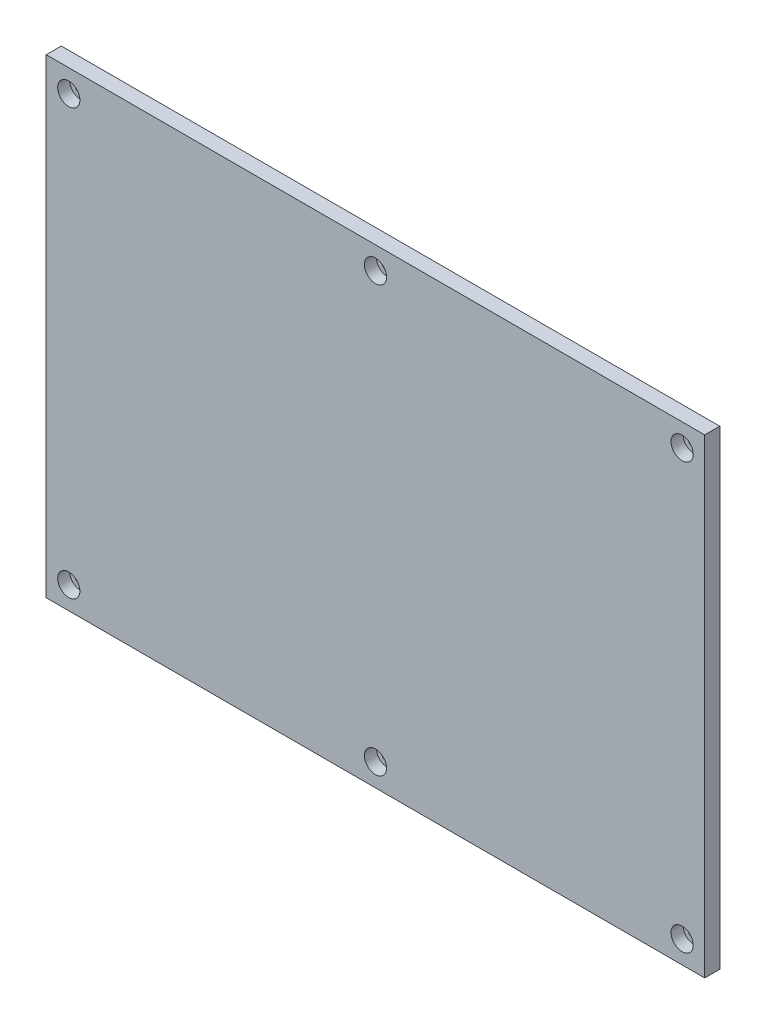
ISO-10303-21;
HEADER;
FILE_DESCRIPTION(('STEP AP214'),'2;1');
FILE_NAME('part.step','',(''),(''),'','','');
FILE_SCHEMA(('AUTOMOTIVE_DESIGN { 1 0 10303 214 1 1 1 1 }'));
ENDSEC;
DATA;
#1=APPLICATION_CONTEXT('core data for automotive mechanical design processes');
#2=APPLICATION_PROTOCOL_DEFINITION('international standard','automotive_design',2000,#1);
#3=PRODUCT_CONTEXT('',#1,'mechanical');
#4=PRODUCT('Part','Part','',(#3));
#5=PRODUCT_RELATED_PRODUCT_CATEGORY('part','',(#4));
#6=PRODUCT_DEFINITION_FORMATION('','',#4);
#7=PRODUCT_DEFINITION_CONTEXT('part definition',#1,'design');
#8=PRODUCT_DEFINITION('design','',#6,#7);
#9=PRODUCT_DEFINITION_SHAPE('','',#8);
#10=(LENGTH_UNIT() NAMED_UNIT(*) SI_UNIT(.MILLI.,.METRE.));
#11=(NAMED_UNIT(*) PLANE_ANGLE_UNIT() SI_UNIT($,.RADIAN.));
#12=(NAMED_UNIT(*) SI_UNIT($,.STERADIAN.) SOLID_ANGLE_UNIT());
#13=UNCERTAINTY_MEASURE_WITH_UNIT(LENGTH_MEASURE(1.E-05),#10,'distance_accuracy_value','');
#14=(GEOMETRIC_REPRESENTATION_CONTEXT(3) GLOBAL_UNCERTAINTY_ASSIGNED_CONTEXT((#13)) GLOBAL_UNIT_ASSIGNED_CONTEXT((#10,
#11,#12)) REPRESENTATION_CONTEXT('',''));
#15=CARTESIAN_POINT('',(0.,0.,0.));
#16=DIRECTION('',(0.,0.,1.));
#17=DIRECTION('',(1.,0.,0.));
#18=AXIS2_PLACEMENT_3D('',#15,#16,#17);
#19=CARTESIAN_POINT('',(0.,0.,4.));
#20=DIRECTION('',(1.,0.,0.));
#21=DIRECTION('',(0.,0.,-1.));
#22=AXIS2_PLACEMENT_3D('',#19,#20,#21);
#23=PLANE('',#22);
#24=DIRECTION('',(0.,-1.,0.));
#25=VECTOR('',#24,1.);
#26=CARTESIAN_POINT('',(0.,0.,0.));
#27=LINE('',#26,#25);
#28=CARTESIAN_POINT('',(0.,125.,0.));
#29=VERTEX_POINT('',#28);
#30=CARTESIAN_POINT('',(0.,0.,0.));
#31=VERTEX_POINT('',#30);
#32=EDGE_CURVE('E107',#29,#31,#27,.T.);
#33=ORIENTED_EDGE('',*,*,#32,.T.);
#34=DIRECTION('',(0.,0.,-1.));
#35=VECTOR('',#34,1.);
#36=CARTESIAN_POINT('',(0.,0.,4.));
#37=LINE('',#36,#35);
#38=CARTESIAN_POINT('',(0.,0.,4.));
#39=VERTEX_POINT('',#38);
#40=EDGE_CURVE('E11',#39,#31,#37,.T.);
#41=ORIENTED_EDGE('',*,*,#40,.F.);
#42=DIRECTION('',(0.,-1.,0.));
#43=VECTOR('',#42,1.);
#44=CARTESIAN_POINT('',(0.,0.,4.));
#45=LINE('',#44,#43);
#46=CARTESIAN_POINT('',(0.,125.,4.));
#47=VERTEX_POINT('',#46);
#48=EDGE_CURVE('E94',#47,#39,#45,.T.);
#49=ORIENTED_EDGE('',*,*,#48,.F.);
#50=DIRECTION('',(0.,0.,-1.));
#51=VECTOR('',#50,1.);
#52=CARTESIAN_POINT('',(0.,125.,4.));
#53=LINE('',#52,#51);
#54=EDGE_CURVE('E103',#47,#29,#53,.T.);
#55=ORIENTED_EDGE('',*,*,#54,.T.);
#56=EDGE_LOOP('',(#33,#41,#49,#55));
#57=FACE_BOUND('',#56,.T.);
#58=ADVANCED_FACE('F41',(#57),#23,.F.);
#59=CARTESIAN_POINT('',(0.,0.,4.));
#60=DIRECTION('',(0.,1.,0.));
#61=DIRECTION('',(0.,0.,1.));
#62=AXIS2_PLACEMENT_3D('',#59,#60,#61);
#63=PLANE('',#62);
#64=DIRECTION('',(1.,0.,0.));
#65=VECTOR('',#64,1.);
#66=CARTESIAN_POINT('',(0.,0.,0.));
#67=LINE('',#66,#65);
#68=CARTESIAN_POINT('',(175.,0.,0.));
#69=VERTEX_POINT('',#68);
#70=EDGE_CURVE('E98',#31,#69,#67,.T.);
#71=ORIENTED_EDGE('',*,*,#70,.T.);
#72=DIRECTION('',(0.,0.,-1.));
#73=VECTOR('',#72,1.);
#74=CARTESIAN_POINT('',(175.,0.,4.));
#75=LINE('',#74,#73);
#76=CARTESIAN_POINT('',(175.,0.,4.));
#77=VERTEX_POINT('',#76);
#78=EDGE_CURVE('E50',#77,#69,#75,.T.);
#79=ORIENTED_EDGE('',*,*,#78,.F.);
#80=DIRECTION('',(1.,0.,0.));
#81=VECTOR('',#80,1.);
#82=CARTESIAN_POINT('',(0.,0.,4.));
#83=LINE('',#82,#81);
#84=EDGE_CURVE('E89',#39,#77,#83,.T.);
#85=ORIENTED_EDGE('',*,*,#84,.F.);
#86=ORIENTED_EDGE('',*,*,#40,.T.);
#87=EDGE_LOOP('',(#71,#79,#85,#86));
#88=FACE_BOUND('',#87,.T.);
#89=ADVANCED_FACE('F97',(#88),#63,.F.);
#90=CARTESIAN_POINT('',(175.,0.,4.));
#91=DIRECTION('',(-1.,0.,0.));
#92=DIRECTION('',(0.,0.,1.));
#93=AXIS2_PLACEMENT_3D('',#90,#91,#92);
#94=PLANE('',#93);
#95=DIRECTION('',(0.,1.,0.));
#96=VECTOR('',#95,1.);
#97=CARTESIAN_POINT('',(175.,0.,0.));
#98=LINE('',#97,#96);
#99=CARTESIAN_POINT('',(175.,125.,0.));
#100=VERTEX_POINT('',#99);
#101=EDGE_CURVE('E76',#69,#100,#98,.T.);
#102=ORIENTED_EDGE('',*,*,#101,.T.);
#103=DIRECTION('',(0.,0.,-1.));
#104=VECTOR('',#103,1.);
#105=CARTESIAN_POINT('',(175.,125.,4.));
#106=LINE('',#105,#104);
#107=CARTESIAN_POINT('',(175.,125.,4.));
#108=VERTEX_POINT('',#107);
#109=EDGE_CURVE('E99',#108,#100,#106,.T.);
#110=ORIENTED_EDGE('',*,*,#109,.F.);
#111=DIRECTION('',(0.,1.,0.));
#112=VECTOR('',#111,1.);
#113=CARTESIAN_POINT('',(175.,0.,4.));
#114=LINE('',#113,#112);
#115=EDGE_CURVE('E92',#77,#108,#114,.T.);
#116=ORIENTED_EDGE('',*,*,#115,.F.);
#117=ORIENTED_EDGE('',*,*,#78,.T.);
#118=EDGE_LOOP('',(#102,#110,#116,#117));
#119=FACE_BOUND('',#118,.T.);
#120=ADVANCED_FACE('F101',(#119),#94,.F.);
#121=CARTESIAN_POINT('',(0.,125.,4.));
#122=DIRECTION('',(0.,-1.,0.));
#123=DIRECTION('',(0.,0.,-1.));
#124=AXIS2_PLACEMENT_3D('',#121,#122,#123);
#125=PLANE('',#124);
#126=DIRECTION('',(-1.,0.,0.));
#127=VECTOR('',#126,1.);
#128=CARTESIAN_POINT('',(0.,125.,0.));
#129=LINE('',#128,#127);
#130=EDGE_CURVE('E82',#100,#29,#129,.T.);
#131=ORIENTED_EDGE('',*,*,#130,.T.);
#132=ORIENTED_EDGE('',*,*,#54,.F.);
#133=DIRECTION('',(-1.,0.,0.));
#134=VECTOR('',#133,1.);
#135=CARTESIAN_POINT('',(0.,125.,4.));
#136=LINE('',#135,#134);
#137=EDGE_CURVE('E59',#108,#47,#136,.T.);
#138=ORIENTED_EDGE('',*,*,#137,.F.);
#139=ORIENTED_EDGE('',*,*,#109,.T.);
#140=EDGE_LOOP('',(#131,#132,#138,#139));
#141=FACE_BOUND('',#140,.T.);
#142=ADVANCED_FACE('F179',(#141),#125,.F.);
#143=CARTESIAN_POINT('',(0.,0.,4.));
#144=DIRECTION('',(0.,0.,-1.));
#145=DIRECTION('',(-1.,0.,0.));
#146=AXIS2_PLACEMENT_3D('',#143,#144,#145);
#147=PLANE('',#146);
#148=CARTESIAN_POINT('',(87.5,119.,4.));
#149=DIRECTION('',(0.,0.,1.));
#150=DIRECTION('',(1.,0.,0.));
#151=AXIS2_PLACEMENT_3D('',#148,#149,#150);
#152=CIRCLE('',#151,2.95);
#153=CARTESIAN_POINT('',(90.45,119.,4.));
#154=VERTEX_POINT('',#153);
#155=EDGE_CURVE('E153',#154,#154,#152,.T.);
#156=ORIENTED_EDGE('',*,*,#155,.F.);
#157=EDGE_LOOP('',(#156));
#158=FACE_BOUND('',#157,.T.);
#159=CARTESIAN_POINT('',(169.,6.,4.));
#160=DIRECTION('',(0.,0.,1.));
#161=DIRECTION('',(1.,0.,0.));
#162=AXIS2_PLACEMENT_3D('',#159,#160,#161);
#163=CIRCLE('',#162,2.95);
#164=CARTESIAN_POINT('',(171.95,6.,4.));
#165=VERTEX_POINT('',#164);
#166=EDGE_CURVE('E146',#165,#165,#163,.T.);
#167=ORIENTED_EDGE('',*,*,#166,.F.);
#168=EDGE_LOOP('',(#167));
#169=FACE_BOUND('',#168,.T.);
#170=CARTESIAN_POINT('',(6.,6.,4.));
#171=DIRECTION('',(0.,0.,1.));
#172=DIRECTION('',(1.,0.,0.));
#173=AXIS2_PLACEMENT_3D('',#170,#171,#172);
#174=CIRCLE('',#173,2.95);
#175=CARTESIAN_POINT('',(8.95,6.,4.));
#176=VERTEX_POINT('',#175);
#177=EDGE_CURVE('E165',#176,#176,#174,.T.);
#178=ORIENTED_EDGE('',*,*,#177,.F.);
#179=EDGE_LOOP('',(#178));
#180=FACE_BOUND('',#179,.T.);
#181=CARTESIAN_POINT('',(169.,119.,4.));
#182=DIRECTION('',(0.,0.,1.));
#183=DIRECTION('',(1.,0.,0.));
#184=AXIS2_PLACEMENT_3D('',#181,#182,#183);
#185=CIRCLE('',#184,2.95);
#186=CARTESIAN_POINT('',(171.95,119.,4.));
#187=VERTEX_POINT('',#186);
#188=EDGE_CURVE('E158',#187,#187,#185,.T.);
#189=ORIENTED_EDGE('',*,*,#188,.F.);
#190=EDGE_LOOP('',(#189));
#191=FACE_BOUND('',#190,.T.);
#192=CARTESIAN_POINT('',(87.5,6.00000000000001,4.));
#193=DIRECTION('',(0.,0.,1.));
#194=DIRECTION('',(1.,0.,0.));
#195=AXIS2_PLACEMENT_3D('',#192,#193,#194);
#196=CIRCLE('',#195,2.95);
#197=CARTESIAN_POINT('',(90.45,6.00000000000001,4.));
#198=VERTEX_POINT('',#197);
#199=EDGE_CURVE('E137',#198,#198,#196,.T.);
#200=ORIENTED_EDGE('',*,*,#199,.F.);
#201=EDGE_LOOP('',(#200));
#202=FACE_BOUND('',#201,.T.);
#203=CARTESIAN_POINT('',(6.,119.,4.));
#204=DIRECTION('',(0.,0.,1.));
#205=DIRECTION('',(1.,0.,0.));
#206=AXIS2_PLACEMENT_3D('',#203,#204,#205);
#207=CIRCLE('',#206,2.95);
#208=CARTESIAN_POINT('',(8.95,119.,4.));
#209=VERTEX_POINT('',#208);
#210=EDGE_CURVE('E161',#209,#209,#207,.T.);
#211=ORIENTED_EDGE('',*,*,#210,.F.);
#212=EDGE_LOOP('',(#211));
#213=FACE_BOUND('',#212,.T.);
#214=ORIENTED_EDGE('',*,*,#48,.T.);
#215=ORIENTED_EDGE('',*,*,#84,.T.);
#216=ORIENTED_EDGE('',*,*,#115,.T.);
#217=ORIENTED_EDGE('',*,*,#137,.T.);
#218=EDGE_LOOP('',(#214,#215,#216,#217));
#219=FACE_BOUND('',#218,.T.);
#220=ADVANCED_FACE('F90',(#158,#169,#180,#191,#202,#213,#219),#147,.F.);
#221=CARTESIAN_POINT('',(0.,0.,0.));
#222=DIRECTION('',(0.,0.,-1.));
#223=DIRECTION('',(-1.,0.,0.));
#224=AXIS2_PLACEMENT_3D('',#221,#222,#223);
#225=PLANE('',#224);
#226=CARTESIAN_POINT('',(6.,6.,0.));
#227=DIRECTION('',(0.,0.,-1.));
#228=DIRECTION('',(-1.,0.,0.));
#229=AXIS2_PLACEMENT_3D('',#226,#227,#228);
#230=CIRCLE('',#229,1.7);
#231=CARTESIAN_POINT('',(4.3,6.,0.));
#232=VERTEX_POINT('',#231);
#233=EDGE_CURVE('E44',#232,#232,#230,.T.);
#234=ORIENTED_EDGE('',*,*,#233,.F.);
#235=EDGE_LOOP('',(#234));
#236=FACE_BOUND('',#235,.T.);
#237=CARTESIAN_POINT('',(87.5,6.00000000000001,0.));
#238=DIRECTION('',(0.,0.,-1.));
#239=DIRECTION('',(-1.,0.,0.));
#240=AXIS2_PLACEMENT_3D('',#237,#238,#239);
#241=CIRCLE('',#240,1.7);
#242=CARTESIAN_POINT('',(85.8,6.00000000000001,0.));
#243=VERTEX_POINT('',#242);
#244=EDGE_CURVE('E128',#243,#243,#241,.T.);
#245=ORIENTED_EDGE('',*,*,#244,.F.);
#246=EDGE_LOOP('',(#245));
#247=FACE_BOUND('',#246,.T.);
#248=CARTESIAN_POINT('',(169.,6.,0.));
#249=DIRECTION('',(0.,0.,-1.));
#250=DIRECTION('',(-1.,0.,0.));
#251=AXIS2_PLACEMENT_3D('',#248,#249,#250);
#252=CIRCLE('',#251,1.70000000000001);
#253=CARTESIAN_POINT('',(167.3,6.,0.));
#254=VERTEX_POINT('',#253);
#255=EDGE_CURVE('E126',#254,#254,#252,.T.);
#256=ORIENTED_EDGE('',*,*,#255,.F.);
#257=EDGE_LOOP('',(#256));
#258=FACE_BOUND('',#257,.T.);
#259=CARTESIAN_POINT('',(169.,119.,0.));
#260=DIRECTION('',(0.,0.,-1.));
#261=DIRECTION('',(-1.,0.,0.));
#262=AXIS2_PLACEMENT_3D('',#259,#260,#261);
#263=CIRCLE('',#262,1.70000000000001);
#264=CARTESIAN_POINT('',(167.3,119.,0.));
#265=VERTEX_POINT('',#264);
#266=EDGE_CURVE('E123',#265,#265,#263,.T.);
#267=ORIENTED_EDGE('',*,*,#266,.F.);
#268=EDGE_LOOP('',(#267));
#269=FACE_BOUND('',#268,.T.);
#270=CARTESIAN_POINT('',(87.5,119.,0.));
#271=DIRECTION('',(0.,0.,-1.));
#272=DIRECTION('',(-1.,0.,0.));
#273=AXIS2_PLACEMENT_3D('',#270,#271,#272);
#274=CIRCLE('',#273,1.7);
#275=CARTESIAN_POINT('',(85.8,119.,0.));
#276=VERTEX_POINT('',#275);
#277=EDGE_CURVE('E119',#276,#276,#274,.T.);
#278=ORIENTED_EDGE('',*,*,#277,.F.);
#279=EDGE_LOOP('',(#278));
#280=FACE_BOUND('',#279,.T.);
#281=CARTESIAN_POINT('',(6.,119.,0.));
#282=DIRECTION('',(0.,0.,-1.));
#283=DIRECTION('',(-1.,0.,0.));
#284=AXIS2_PLACEMENT_3D('',#281,#282,#283);
#285=CIRCLE('',#284,1.7);
#286=CARTESIAN_POINT('',(4.3,119.,0.));
#287=VERTEX_POINT('',#286);
#288=EDGE_CURVE('E116',#287,#287,#285,.T.);
#289=ORIENTED_EDGE('',*,*,#288,.F.);
#290=EDGE_LOOP('',(#289));
#291=FACE_BOUND('',#290,.T.);
#292=ORIENTED_EDGE('',*,*,#32,.F.);
#293=ORIENTED_EDGE('',*,*,#130,.F.);
#294=ORIENTED_EDGE('',*,*,#101,.F.);
#295=ORIENTED_EDGE('',*,*,#70,.F.);
#296=EDGE_LOOP('',(#292,#293,#294,#295));
#297=FACE_BOUND('',#296,.T.);
#298=ADVANCED_FACE('F178',(#236,#247,#258,#269,#280,#291,#297),#225,.T.);
#299=CARTESIAN_POINT('',(6.,119.,0.8));
#300=DIRECTION('',(0.,0.,1.));
#301=DIRECTION('',(1.,0.,0.));
#302=AXIS2_PLACEMENT_3D('',#299,#300,#301);
#303=CYLINDRICAL_SURFACE('',#302,2.95);
#304=CARTESIAN_POINT('',(6.,119.,0.8));
#305=DIRECTION('',(0.,0.,1.));
#306=DIRECTION('',(1.,0.,0.));
#307=AXIS2_PLACEMENT_3D('',#304,#305,#306);
#308=CIRCLE('',#307,2.95);
#309=CARTESIAN_POINT('',(8.95,119.,0.8));
#310=VERTEX_POINT('',#309);
#311=EDGE_CURVE('E110',#310,#310,#308,.T.);
#312=ORIENTED_EDGE('',*,*,#311,.F.);
#313=EDGE_LOOP('',(#312));
#314=FACE_BOUND('',#313,.T.);
#315=ORIENTED_EDGE('',*,*,#210,.T.);
#316=EDGE_LOOP('',(#315));
#317=FACE_BOUND('',#316,.T.);
#318=ADVANCED_FACE('F175',(#314,#317),#303,.F.);
#319=CARTESIAN_POINT('',(6.,119.,0.8));
#320=DIRECTION('',(0.,0.,1.));
#321=DIRECTION('',(1.,0.,0.));
#322=AXIS2_PLACEMENT_3D('',#319,#320,#321);
#323=PLANE('',#322);
#324=CARTESIAN_POINT('',(6.,119.,0.8));
#325=DIRECTION('',(0.,0.,1.));
#326=DIRECTION('',(1.,0.,0.));
#327=AXIS2_PLACEMENT_3D('',#324,#325,#326);
#328=CIRCLE('',#327,1.7);
#329=CARTESIAN_POINT('',(7.7,119.,0.8));
#330=VERTEX_POINT('',#329);
#331=EDGE_CURVE('E120',#330,#330,#328,.T.);
#332=ORIENTED_EDGE('',*,*,#331,.F.);
#333=EDGE_LOOP('',(#332));
#334=FACE_BOUND('',#333,.T.);
#335=ORIENTED_EDGE('',*,*,#311,.T.);
#336=EDGE_LOOP('',(#335));
#337=FACE_BOUND('',#336,.T.);
#338=ADVANCED_FACE('F232',(#334,#337),#323,.T.);
#339=CARTESIAN_POINT('',(87.5,6.00000000000001,0.8));
#340=DIRECTION('',(0.,0.,1.));
#341=DIRECTION('',(1.,0.,0.));
#342=AXIS2_PLACEMENT_3D('',#339,#340,#341);
#343=CYLINDRICAL_SURFACE('',#342,2.95);
#344=CARTESIAN_POINT('',(87.5,6.00000000000001,0.8));
#345=DIRECTION('',(0.,0.,1.));
#346=DIRECTION('',(1.,0.,0.));
#347=AXIS2_PLACEMENT_3D('',#344,#345,#346);
#348=CIRCLE('',#347,2.95);
#349=CARTESIAN_POINT('',(90.45,6.00000000000001,0.8));
#350=VERTEX_POINT('',#349);
#351=EDGE_CURVE('E133',#350,#350,#348,.T.);
#352=ORIENTED_EDGE('',*,*,#351,.F.);
#353=EDGE_LOOP('',(#352));
#354=FACE_BOUND('',#353,.T.);
#355=ORIENTED_EDGE('',*,*,#199,.T.);
#356=EDGE_LOOP('',(#355));
#357=FACE_BOUND('',#356,.T.);
#358=ADVANCED_FACE('F241',(#354,#357),#343,.F.);
#359=CARTESIAN_POINT('',(87.5,6.00000000000001,0.8));
#360=DIRECTION('',(0.,0.,1.));
#361=DIRECTION('',(1.,0.,0.));
#362=AXIS2_PLACEMENT_3D('',#359,#360,#361);
#363=PLANE('',#362);
#364=CARTESIAN_POINT('',(87.5,6.00000000000001,0.8));
#365=DIRECTION('',(0.,0.,1.));
#366=DIRECTION('',(1.,0.,0.));
#367=AXIS2_PLACEMENT_3D('',#364,#365,#366);
#368=CIRCLE('',#367,1.7);
#369=CARTESIAN_POINT('',(89.2,6.00000000000001,0.8));
#370=VERTEX_POINT('',#369);
#371=EDGE_CURVE('E404',#370,#370,#368,.T.);
#372=ORIENTED_EDGE('',*,*,#371,.F.);
#373=EDGE_LOOP('',(#372));
#374=FACE_BOUND('',#373,.T.);
#375=ORIENTED_EDGE('',*,*,#351,.T.);
#376=EDGE_LOOP('',(#375));
#377=FACE_BOUND('',#376,.T.);
#378=ADVANCED_FACE('F251',(#374,#377),#363,.T.);
#379=CARTESIAN_POINT('',(169.,119.,0.8));
#380=DIRECTION('',(0.,0.,1.));
#381=DIRECTION('',(1.,0.,0.));
#382=AXIS2_PLACEMENT_3D('',#379,#380,#381);
#383=CYLINDRICAL_SURFACE('',#382,2.95);
#384=CARTESIAN_POINT('',(169.,119.,0.8));
#385=DIRECTION('',(0.,0.,1.));
#386=DIRECTION('',(1.,0.,0.));
#387=AXIS2_PLACEMENT_3D('',#384,#385,#386);
#388=CIRCLE('',#387,2.95);
#389=CARTESIAN_POINT('',(171.95,119.,0.8));
#390=VERTEX_POINT('',#389);
#391=EDGE_CURVE('E162',#390,#390,#388,.T.);
#392=ORIENTED_EDGE('',*,*,#391,.F.);
#393=EDGE_LOOP('',(#392));
#394=FACE_BOUND('',#393,.T.);
#395=ORIENTED_EDGE('',*,*,#188,.T.);
#396=EDGE_LOOP('',(#395));
#397=FACE_BOUND('',#396,.T.);
#398=ADVANCED_FACE('F261',(#394,#397),#383,.F.);
#399=CARTESIAN_POINT('',(169.,119.,0.8));
#400=DIRECTION('',(0.,0.,1.));
#401=DIRECTION('',(1.,0.,0.));
#402=AXIS2_PLACEMENT_3D('',#399,#400,#401);
#403=PLANE('',#402);
#404=CARTESIAN_POINT('',(169.,119.,0.8));
#405=DIRECTION('',(0.,0.,1.));
#406=DIRECTION('',(1.,0.,0.));
#407=AXIS2_PLACEMENT_3D('',#404,#405,#406);
#408=CIRCLE('',#407,1.70000000000001);
#409=CARTESIAN_POINT('',(170.7,119.,0.8));
#410=VERTEX_POINT('',#409);
#411=EDGE_CURVE('E415',#410,#410,#408,.T.);
#412=ORIENTED_EDGE('',*,*,#411,.F.);
#413=EDGE_LOOP('',(#412));
#414=FACE_BOUND('',#413,.T.);
#415=ORIENTED_EDGE('',*,*,#391,.T.);
#416=EDGE_LOOP('',(#415));
#417=FACE_BOUND('',#416,.T.);
#418=ADVANCED_FACE('F271',(#414,#417),#403,.T.);
#419=CARTESIAN_POINT('',(6.,6.,0.8));
#420=DIRECTION('',(0.,0.,1.));
#421=DIRECTION('',(1.,0.,0.));
#422=AXIS2_PLACEMENT_3D('',#419,#420,#421);
#423=CYLINDRICAL_SURFACE('',#422,2.95);
#424=CARTESIAN_POINT('',(6.,6.,0.8));
#425=DIRECTION('',(0.,0.,1.));
#426=DIRECTION('',(1.,0.,0.));
#427=AXIS2_PLACEMENT_3D('',#424,#425,#426);
#428=CIRCLE('',#427,2.95);
#429=CARTESIAN_POINT('',(8.95,6.,0.8));
#430=VERTEX_POINT('',#429);
#431=EDGE_CURVE('E149',#430,#430,#428,.T.);
#432=ORIENTED_EDGE('',*,*,#431,.F.);
#433=EDGE_LOOP('',(#432));
#434=FACE_BOUND('',#433,.T.);
#435=ORIENTED_EDGE('',*,*,#177,.T.);
#436=EDGE_LOOP('',(#435));
#437=FACE_BOUND('',#436,.T.);
#438=ADVANCED_FACE('F281',(#434,#437),#423,.F.);
#439=CARTESIAN_POINT('',(6.,6.,0.8));
#440=DIRECTION('',(0.,0.,1.));
#441=DIRECTION('',(1.,0.,0.));
#442=AXIS2_PLACEMENT_3D('',#439,#440,#441);
#443=PLANE('',#442);
#444=CARTESIAN_POINT('',(6.,6.,0.8));
#445=DIRECTION('',(0.,0.,1.));
#446=DIRECTION('',(1.,0.,0.));
#447=AXIS2_PLACEMENT_3D('',#444,#445,#446);
#448=CIRCLE('',#447,1.7);
#449=CARTESIAN_POINT('',(7.7,6.,0.8));
#450=VERTEX_POINT('',#449);
#451=EDGE_CURVE('E403',#450,#450,#448,.T.);
#452=ORIENTED_EDGE('',*,*,#451,.F.);
#453=EDGE_LOOP('',(#452));
#454=FACE_BOUND('',#453,.T.);
#455=ORIENTED_EDGE('',*,*,#431,.T.);
#456=EDGE_LOOP('',(#455));
#457=FACE_BOUND('',#456,.T.);
#458=ADVANCED_FACE('F291',(#454,#457),#443,.T.);
#459=CARTESIAN_POINT('',(169.,6.,0.8));
#460=DIRECTION('',(0.,0.,1.));
#461=DIRECTION('',(1.,0.,0.));
#462=AXIS2_PLACEMENT_3D('',#459,#460,#461);
#463=CYLINDRICAL_SURFACE('',#462,2.95);
#464=CARTESIAN_POINT('',(169.,6.,0.8));
#465=DIRECTION('',(0.,0.,1.));
#466=DIRECTION('',(1.,0.,0.));
#467=AXIS2_PLACEMENT_3D('',#464,#465,#466);
#468=CIRCLE('',#467,2.95);
#469=CARTESIAN_POINT('',(171.95,6.,0.8));
#470=VERTEX_POINT('',#469);
#471=EDGE_CURVE('E150',#470,#470,#468,.T.);
#472=ORIENTED_EDGE('',*,*,#471,.F.);
#473=EDGE_LOOP('',(#472));
#474=FACE_BOUND('',#473,.T.);
#475=ORIENTED_EDGE('',*,*,#166,.T.);
#476=EDGE_LOOP('',(#475));
#477=FACE_BOUND('',#476,.T.);
#478=ADVANCED_FACE('F301',(#474,#477),#463,.F.);
#479=CARTESIAN_POINT('',(169.,6.,0.8));
#480=DIRECTION('',(0.,0.,1.));
#481=DIRECTION('',(1.,0.,0.));
#482=AXIS2_PLACEMENT_3D('',#479,#480,#481);
#483=PLANE('',#482);
#484=CARTESIAN_POINT('',(169.,6.,0.8));
#485=DIRECTION('',(0.,0.,1.));
#486=DIRECTION('',(1.,0.,0.));
#487=AXIS2_PLACEMENT_3D('',#484,#485,#486);
#488=CIRCLE('',#487,1.70000000000001);
#489=CARTESIAN_POINT('',(170.7,6.,0.8));
#490=VERTEX_POINT('',#489);
#491=EDGE_CURVE('E407',#490,#490,#488,.T.);
#492=ORIENTED_EDGE('',*,*,#491,.F.);
#493=EDGE_LOOP('',(#492));
#494=FACE_BOUND('',#493,.T.);
#495=ORIENTED_EDGE('',*,*,#471,.T.);
#496=EDGE_LOOP('',(#495));
#497=FACE_BOUND('',#496,.T.);
#498=ADVANCED_FACE('F311',(#494,#497),#483,.T.);
#499=CARTESIAN_POINT('',(87.5,119.,0.8));
#500=DIRECTION('',(0.,0.,1.));
#501=DIRECTION('',(1.,0.,0.));
#502=AXIS2_PLACEMENT_3D('',#499,#500,#501);
#503=CYLINDRICAL_SURFACE('',#502,2.95);
#504=CARTESIAN_POINT('',(87.5,119.,0.8));
#505=DIRECTION('',(0.,0.,1.));
#506=DIRECTION('',(1.,0.,0.));
#507=AXIS2_PLACEMENT_3D('',#504,#505,#506);
#508=CIRCLE('',#507,2.95);
#509=CARTESIAN_POINT('',(90.45,119.,0.8));
#510=VERTEX_POINT('',#509);
#511=EDGE_CURVE('E142',#510,#510,#508,.T.);
#512=ORIENTED_EDGE('',*,*,#511,.F.);
#513=EDGE_LOOP('',(#512));
#514=FACE_BOUND('',#513,.T.);
#515=ORIENTED_EDGE('',*,*,#155,.T.);
#516=EDGE_LOOP('',(#515));
#517=FACE_BOUND('',#516,.T.);
#518=ADVANCED_FACE('F320',(#514,#517),#503,.F.);
#519=CARTESIAN_POINT('',(87.5,119.,0.8));
#520=DIRECTION('',(0.,0.,1.));
#521=DIRECTION('',(1.,0.,0.));
#522=AXIS2_PLACEMENT_3D('',#519,#520,#521);
#523=PLANE('',#522);
#524=CARTESIAN_POINT('',(87.5,119.,0.8));
#525=DIRECTION('',(0.,0.,1.));
#526=DIRECTION('',(1.,0.,0.));
#527=AXIS2_PLACEMENT_3D('',#524,#525,#526);
#528=CIRCLE('',#527,1.7);
#529=CARTESIAN_POINT('',(89.2,119.,0.8));
#530=VERTEX_POINT('',#529);
#531=EDGE_CURVE('E411',#530,#530,#528,.T.);
#532=ORIENTED_EDGE('',*,*,#531,.F.);
#533=EDGE_LOOP('',(#532));
#534=FACE_BOUND('',#533,.T.);
#535=ORIENTED_EDGE('',*,*,#511,.T.);
#536=EDGE_LOOP('',(#535));
#537=FACE_BOUND('',#536,.T.);
#538=ADVANCED_FACE('F330',(#534,#537),#523,.T.);
#539=CARTESIAN_POINT('',(6.,119.,-2.4));
#540=DIRECTION('',(0.,0.,1.));
#541=DIRECTION('',(1.,0.,0.));
#542=AXIS2_PLACEMENT_3D('',#539,#540,#541);
#543=CYLINDRICAL_SURFACE('',#542,1.7);
#544=ORIENTED_EDGE('',*,*,#288,.T.);
#545=EDGE_LOOP('',(#544));
#546=FACE_BOUND('',#545,.T.);
#547=ORIENTED_EDGE('',*,*,#331,.T.);
#548=EDGE_LOOP('',(#547));
#549=FACE_BOUND('',#548,.T.);
#550=ADVANCED_FACE('F339',(#546,#549),#543,.F.);
#551=CARTESIAN_POINT('',(87.5,119.,-2.4));
#552=DIRECTION('',(0.,0.,1.));
#553=DIRECTION('',(1.,0.,0.));
#554=AXIS2_PLACEMENT_3D('',#551,#552,#553);
#555=CYLINDRICAL_SURFACE('',#554,1.7);
#556=ORIENTED_EDGE('',*,*,#277,.T.);
#557=EDGE_LOOP('',(#556));
#558=FACE_BOUND('',#557,.T.);
#559=ORIENTED_EDGE('',*,*,#531,.T.);
#560=EDGE_LOOP('',(#559));
#561=FACE_BOUND('',#560,.T.);
#562=ADVANCED_FACE('F349',(#558,#561),#555,.F.);
#563=CARTESIAN_POINT('',(169.,119.,-2.4));
#564=DIRECTION('',(0.,0.,1.));
#565=DIRECTION('',(1.,0.,0.));
#566=AXIS2_PLACEMENT_3D('',#563,#564,#565);
#567=CYLINDRICAL_SURFACE('',#566,1.70000000000001);
#568=ORIENTED_EDGE('',*,*,#266,.T.);
#569=EDGE_LOOP('',(#568));
#570=FACE_BOUND('',#569,.T.);
#571=ORIENTED_EDGE('',*,*,#411,.T.);
#572=EDGE_LOOP('',(#571));
#573=FACE_BOUND('',#572,.T.);
#574=ADVANCED_FACE('F359',(#570,#573),#567,.F.);
#575=CARTESIAN_POINT('',(169.,6.,-2.4));
#576=DIRECTION('',(0.,0.,1.));
#577=DIRECTION('',(1.,0.,0.));
#578=AXIS2_PLACEMENT_3D('',#575,#576,#577);
#579=CYLINDRICAL_SURFACE('',#578,1.70000000000001);
#580=ORIENTED_EDGE('',*,*,#255,.T.);
#581=EDGE_LOOP('',(#580));
#582=FACE_BOUND('',#581,.T.);
#583=ORIENTED_EDGE('',*,*,#491,.T.);
#584=EDGE_LOOP('',(#583));
#585=FACE_BOUND('',#584,.T.);
#586=ADVANCED_FACE('F369',(#582,#585),#579,.F.);
#587=CARTESIAN_POINT('',(87.5,6.00000000000001,-2.4));
#588=DIRECTION('',(0.,0.,1.));
#589=DIRECTION('',(1.,0.,0.));
#590=AXIS2_PLACEMENT_3D('',#587,#588,#589);
#591=CYLINDRICAL_SURFACE('',#590,1.7);
#592=ORIENTED_EDGE('',*,*,#244,.T.);
#593=EDGE_LOOP('',(#592));
#594=FACE_BOUND('',#593,.T.);
#595=ORIENTED_EDGE('',*,*,#371,.T.);
#596=EDGE_LOOP('',(#595));
#597=FACE_BOUND('',#596,.T.);
#598=ADVANCED_FACE('F379',(#594,#597),#591,.F.);
#599=CARTESIAN_POINT('',(6.,6.,-2.4));
#600=DIRECTION('',(0.,0.,1.));
#601=DIRECTION('',(1.,0.,0.));
#602=AXIS2_PLACEMENT_3D('',#599,#600,#601);
#603=CYLINDRICAL_SURFACE('',#602,1.7);
#604=ORIENTED_EDGE('',*,*,#233,.T.);
#605=EDGE_LOOP('',(#604));
#606=FACE_BOUND('',#605,.T.);
#607=ORIENTED_EDGE('',*,*,#451,.T.);
#608=EDGE_LOOP('',(#607));
#609=FACE_BOUND('',#608,.T.);
#610=ADVANCED_FACE('F389',(#606,#609),#603,.F.);
#611=CLOSED_SHELL('',(#58,#89,#120,#142,#220,#298,#318,#338,#358,#378,#398,#418,#438,#458,#478,
#498,#518,#538,#550,#562,#574,#586,#598,#610));
#612=MANIFOLD_SOLID_BREP('B2',#611);
#613=ADVANCED_BREP_SHAPE_REPRESENTATION('',(#18,#612),#14);
#614=SHAPE_DEFINITION_REPRESENTATION(#9,#613);
ENDSEC;
END-ISO-10303-21;
